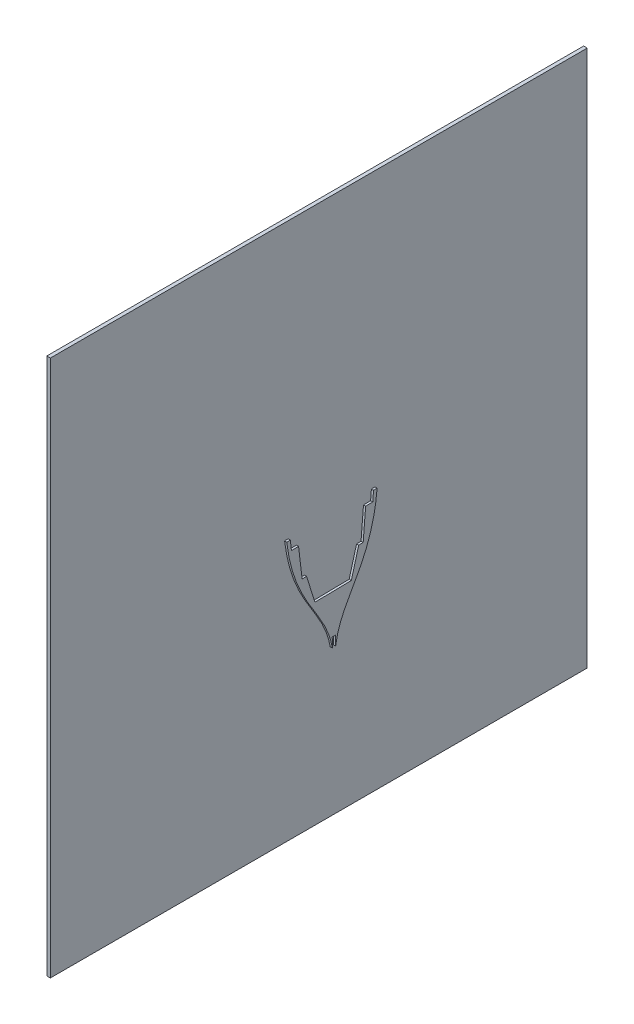
ISO-10303-21;
HEADER;
FILE_DESCRIPTION(('STEP AP214'),'2;1');
FILE_NAME('part.step','',(''),(''),'','','');
FILE_SCHEMA(('AUTOMOTIVE_DESIGN { 1 0 10303 214 1 1 1 1 }'));
ENDSEC;
DATA;
#1=APPLICATION_CONTEXT('core data for automotive mechanical design processes');
#2=APPLICATION_PROTOCOL_DEFINITION('international standard','automotive_design',2000,#1);
#3=PRODUCT_CONTEXT('',#1,'mechanical');
#4=PRODUCT('Part','Part','',(#3));
#5=PRODUCT_RELATED_PRODUCT_CATEGORY('part','',(#4));
#6=PRODUCT_DEFINITION_FORMATION('','',#4);
#7=PRODUCT_DEFINITION_CONTEXT('part definition',#1,'design');
#8=PRODUCT_DEFINITION('design','',#6,#7);
#9=PRODUCT_DEFINITION_SHAPE('','',#8);
#10=(LENGTH_UNIT() NAMED_UNIT(*) SI_UNIT(.MILLI.,.METRE.));
#11=(NAMED_UNIT(*) PLANE_ANGLE_UNIT() SI_UNIT($,.RADIAN.));
#12=(NAMED_UNIT(*) SI_UNIT($,.STERADIAN.) SOLID_ANGLE_UNIT());
#13=UNCERTAINTY_MEASURE_WITH_UNIT(LENGTH_MEASURE(1.E-05),#10,'distance_accuracy_value','');
#14=(GEOMETRIC_REPRESENTATION_CONTEXT(3) GLOBAL_UNCERTAINTY_ASSIGNED_CONTEXT((#13)) GLOBAL_UNIT_ASSIGNED_CONTEXT((#10,
#11,#12)) REPRESENTATION_CONTEXT('',''));
#15=CARTESIAN_POINT('',(0.,0.,0.));
#16=DIRECTION('',(0.,0.,1.));
#17=DIRECTION('',(1.,0.,0.));
#18=AXIS2_PLACEMENT_3D('',#15,#16,#17);
#19=CARTESIAN_POINT('',(6.,361.602212700879,132.834590280757));
#20=CARTESIAN_POINT('',(6.,164.351037202776,108.956470003983));
#21=CARTESIAN_POINT('',(6.,142.634498604343,10.6463537208363));
#22=CARTESIAN_POINT('',(6.,58.2126589897996,5.90653160147248));
#23=CARTESIAN_POINT('',(6.,0.,0.));
#24=B_SPLINE_CURVE_WITH_KNOTS('',4,(#19,#20,#21,#22,#23),.UNSPECIFIED.,.F.,.F.,(5,5),(0.,1.),.UNSPECIFIED.);
#25=DIRECTION('',(-1.,0.,0.));
#26=VECTOR('',#25,1.);
#27=SURFACE_OF_LINEAR_EXTRUSION('',#24,#26);
#28=CARTESIAN_POINT('',(0.,361.602212700879,132.834590280757));
#29=CARTESIAN_POINT('',(0.,164.351037202776,108.956470003983));
#30=CARTESIAN_POINT('',(0.,142.634498604343,10.6463537208363));
#31=CARTESIAN_POINT('',(0.,58.2126589897996,5.90653160147248));
#32=CARTESIAN_POINT('',(0.,0.,0.));
#33=B_SPLINE_CURVE_WITH_KNOTS('',4,(#28,#29,#30,#31,#32),.UNSPECIFIED.,.F.,.F.,(5,5),(0.,1.),.UNSPECIFIED.);
#34=CARTESIAN_POINT('',(0.,361.602212700879,132.834590280757));
#35=VERTEX_POINT('',#34);
#36=CARTESIAN_POINT('',(0.,41.5610946880075,5.2543716604558));
#37=VERTEX_POINT('',#36);
#38=EDGE_CURVE('E192',#35,#37,#33,.T.);
#39=ORIENTED_EDGE('',*,*,#38,.T.);
#40=DIRECTION('',(1.,0.,0.));
#41=VECTOR('',#40,1.);
#42=CARTESIAN_POINT('',(0.,41.5610946880075,5.2543716604558));
#43=LINE('',#42,#41);
#44=CARTESIAN_POINT('',(6.,41.5610946880075,5.2543716604558));
#45=VERTEX_POINT('',#44);
#46=EDGE_CURVE('E198',#37,#45,#43,.T.);
#47=ORIENTED_EDGE('',*,*,#46,.T.);
#48=CARTESIAN_POINT('',(6.,361.602212700879,132.834590280757));
#49=VERTEX_POINT('',#48);
#50=EDGE_CURVE('E232',#49,#45,#24,.T.);
#51=ORIENTED_EDGE('',*,*,#50,.F.);
#52=DIRECTION('',(-1.,0.,0.));
#53=VECTOR('',#52,1.);
#54=CARTESIAN_POINT('',(6.,361.602212700879,132.834590280757));
#55=LINE('',#54,#53);
#56=EDGE_CURVE('E188',#49,#35,#55,.T.);
#57=ORIENTED_EDGE('',*,*,#56,.T.);
#58=EDGE_LOOP('',(#39,#47,#51,#57));
#59=FACE_BOUND('',#58,.T.);
#60=ADVANCED_FACE('F45',(#59),#27,.F.);
#61=CARTESIAN_POINT('',(6.,0.,0.));
#62=CARTESIAN_POINT('',(6.,58.3883924814716,-3.79425956564894));
#63=CARTESIAN_POINT('',(6.,142.926512362681,-5.47330827762449));
#64=CARTESIAN_POINT('',(6.,168.189483530413,-102.932373018065));
#65=CARTESIAN_POINT('',(6.,366.176077391648,-119.650611997159));
#66=B_SPLINE_CURVE_WITH_KNOTS('',4,(#61,#62,#63,#64,#65),.UNSPECIFIED.,.F.,.F.,(5,5),(0.,1.),.UNSPECIFIED.);
#67=DIRECTION('',(-1.,0.,0.));
#68=VECTOR('',#67,1.);
#69=SURFACE_OF_LINEAR_EXTRUSION('',#66,#68);
#70=CARTESIAN_POINT('',(6.,41.7241330833095,-3.7456283395442));
#71=VERTEX_POINT('',#70);
#72=CARTESIAN_POINT('',(6.,366.176077391648,-119.650611997159));
#73=VERTEX_POINT('',#72);
#74=EDGE_CURVE('E128',#71,#73,#66,.T.);
#75=ORIENTED_EDGE('',*,*,#74,.F.);
#76=DIRECTION('',(1.,0.,0.));
#77=VECTOR('',#76,1.);
#78=CARTESIAN_POINT('',(0.,41.7241330833095,-3.7456283395442));
#79=LINE('',#78,#77);
#80=CARTESIAN_POINT('',(0.,41.7241330833095,-3.7456283395442));
#81=VERTEX_POINT('',#80);
#82=EDGE_CURVE('E322',#81,#71,#79,.T.);
#83=ORIENTED_EDGE('',*,*,#82,.F.);
#84=CARTESIAN_POINT('',(0.,0.,0.));
#85=CARTESIAN_POINT('',(0.,58.3883924814716,-3.79425956564894));
#86=CARTESIAN_POINT('',(0.,142.926512362681,-5.47330827762449));
#87=CARTESIAN_POINT('',(0.,168.189483530413,-102.932373018065));
#88=CARTESIAN_POINT('',(0.,366.176077391648,-119.650611997159));
#89=B_SPLINE_CURVE_WITH_KNOTS('',4,(#84,#85,#86,#87,#88),.UNSPECIFIED.,.F.,.F.,(5,5),(0.,1.),.UNSPECIFIED.);
#90=CARTESIAN_POINT('',(0.,366.176077391648,-119.650611997159));
#91=VERTEX_POINT('',#90);
#92=EDGE_CURVE('E197',#81,#91,#89,.T.);
#93=ORIENTED_EDGE('',*,*,#92,.T.);
#94=DIRECTION('',(-1.,0.,0.));
#95=VECTOR('',#94,1.);
#96=CARTESIAN_POINT('',(6.,366.176077391648,-119.650611997159));
#97=LINE('',#96,#95);
#98=EDGE_CURVE('E13',#73,#91,#97,.T.);
#99=ORIENTED_EDGE('',*,*,#98,.F.);
#100=EDGE_LOOP('',(#75,#83,#93,#99));
#101=FACE_BOUND('',#100,.T.);
#102=ADVANCED_FACE('F334',(#101),#69,.F.);
#103=CARTESIAN_POINT('',(6.,366.176077391648,-119.650611997159));
#104=DIRECTION('',(0.,-0.999835956927465,-0.0181124055536444));
#105=DIRECTION('',(0.,0.0181124055536444,-0.999835956927465));
#106=AXIS2_PLACEMENT_3D('',#103,#104,#105);
#107=PLANE('',#106);
#108=DIRECTION('',(0.,-0.0181124055536444,0.999835956927465));
#109=VECTOR('',#108,1.);
#110=CARTESIAN_POINT('',(0.,366.176077391648,-119.650611997159));
#111=LINE('',#110,#109);
#112=CARTESIAN_POINT('',(0.,365.99492361909,-109.650611997159));
#113=VERTEX_POINT('',#112);
#114=EDGE_CURVE('E205',#91,#113,#111,.T.);
#115=ORIENTED_EDGE('',*,*,#114,.T.);
#116=DIRECTION('',(-1.,0.,0.));
#117=VECTOR('',#116,1.);
#118=CARTESIAN_POINT('',(6.,365.99492361909,-109.650611997159));
#119=LINE('',#118,#117);
#120=CARTESIAN_POINT('',(6.,365.99492361909,-109.650611997159));
#121=VERTEX_POINT('',#120);
#122=EDGE_CURVE('E53',#121,#113,#119,.T.);
#123=ORIENTED_EDGE('',*,*,#122,.F.);
#124=DIRECTION('',(0.,-0.0181124055536444,0.999835956927465));
#125=VECTOR('',#124,1.);
#126=CARTESIAN_POINT('',(6.,366.176077391648,-119.650611997159));
#127=LINE('',#126,#125);
#128=EDGE_CURVE('E316',#73,#121,#127,.T.);
#129=ORIENTED_EDGE('',*,*,#128,.F.);
#130=ORIENTED_EDGE('',*,*,#98,.T.);
#131=EDGE_LOOP('',(#115,#123,#129,#130));
#132=FACE_BOUND('',#131,.T.);
#133=ADVANCED_FACE('F337',(#132),#107,.F.);
#134=CARTESIAN_POINT('',(6.,365.99492361909,-109.650611997159));
#135=DIRECTION('',(0.,-0.0782638409439782,-0.996932681378585));
#136=DIRECTION('',(0.,0.996932681378585,-0.0782638409439782));
#137=AXIS2_PLACEMENT_3D('',#134,#135,#136);
#138=PLANE('',#137);
#139=DIRECTION('',(0.,-0.996932681378585,0.0782638409439782));
#140=VECTOR('',#139,1.);
#141=CARTESIAN_POINT('',(0.,365.99492361909,-109.650611997159));
#142=LINE('',#141,#140);
#143=CARTESIAN_POINT('',(0.,338.792154680511,-107.515068423143));
#144=VERTEX_POINT('',#143);
#145=EDGE_CURVE('E210',#113,#144,#142,.T.);
#146=ORIENTED_EDGE('',*,*,#145,.T.);
#147=DIRECTION('',(-1.,0.,0.));
#148=VECTOR('',#147,1.);
#149=CARTESIAN_POINT('',(6.,338.792154680511,-107.515068423143));
#150=LINE('',#149,#148);
#151=CARTESIAN_POINT('',(6.,338.792154680511,-107.515068423143));
#152=VERTEX_POINT('',#151);
#153=EDGE_CURVE('E257',#152,#144,#150,.T.);
#154=ORIENTED_EDGE('',*,*,#153,.F.);
#155=DIRECTION('',(0.,-0.996932681378585,0.0782638409439782));
#156=VECTOR('',#155,1.);
#157=CARTESIAN_POINT('',(6.,365.99492361909,-109.650611997159));
#158=LINE('',#157,#156);
#159=EDGE_CURVE('E266',#121,#152,#158,.T.);
#160=ORIENTED_EDGE('',*,*,#159,.F.);
#161=ORIENTED_EDGE('',*,*,#122,.T.);
#162=EDGE_LOOP('',(#146,#154,#160,#161));
#163=FACE_BOUND('',#162,.T.);
#164=ADVANCED_FACE('F264',(#163),#138,.F.);
#165=CARTESIAN_POINT('',(6.,338.792154680511,-107.515068423143));
#166=DIRECTION('',(0.,-0.999835956927465,-0.0181124055536416));
#167=DIRECTION('',(0.,0.0181124055536416,-0.999835956927466));
#168=AXIS2_PLACEMENT_3D('',#165,#166,#167);
#169=PLANE('',#168);
#170=DIRECTION('',(0.,-0.0181124055536416,0.999835956927465));
#171=VECTOR('',#170,1.);
#172=CARTESIAN_POINT('',(0.,338.792154680511,-107.515068423143));
#173=LINE('',#172,#171);
#174=CARTESIAN_POINT('',(0.,338.431086885036,-87.5835047368577));
#175=VERTEX_POINT('',#174);
#176=EDGE_CURVE('E212',#144,#175,#173,.T.);
#177=ORIENTED_EDGE('',*,*,#176,.T.);
#178=DIRECTION('',(-1.,0.,0.));
#179=VECTOR('',#178,1.);
#180=CARTESIAN_POINT('',(6.,338.431086885036,-87.5835047368577));
#181=LINE('',#180,#179);
#182=CARTESIAN_POINT('',(6.,338.431086885036,-87.5835047368577));
#183=VERTEX_POINT('',#182);
#184=EDGE_CURVE('E254',#183,#175,#181,.T.);
#185=ORIENTED_EDGE('',*,*,#184,.F.);
#186=DIRECTION('',(0.,-0.0181124055536416,0.999835956927465));
#187=VECTOR('',#186,1.);
#188=CARTESIAN_POINT('',(6.,338.792154680511,-107.515068423143));
#189=LINE('',#188,#187);
#190=EDGE_CURVE('E287',#152,#183,#189,.T.);
#191=ORIENTED_EDGE('',*,*,#190,.F.);
#192=ORIENTED_EDGE('',*,*,#153,.T.);
#193=EDGE_LOOP('',(#177,#185,#191,#192));
#194=FACE_BOUND('',#193,.T.);
#195=ADVANCED_FACE('F278',(#194),#169,.F.);
#196=CARTESIAN_POINT('',(6.,338.431086885036,-87.5835047368577));
#197=DIRECTION('',(0.,-0.0808804811789135,-0.996723807162379));
#198=DIRECTION('',(0.,0.996723807162379,-0.0808804811789135));
#199=AXIS2_PLACEMENT_3D('',#196,#197,#198);
#200=PLANE('',#199);
#201=DIRECTION('',(0.,-0.996723807162379,0.0808804811789134));
#202=VECTOR('',#201,1.);
#203=CARTESIAN_POINT('',(0.,338.431086885036,-87.5835047368577));
#204=LINE('',#203,#202);
#205=CARTESIAN_POINT('',(0.,254.083869200384,-80.7390373895198));
#206=VERTEX_POINT('',#205);
#207=EDGE_CURVE('E214',#175,#206,#204,.T.);
#208=ORIENTED_EDGE('',*,*,#207,.T.);
#209=DIRECTION('',(-1.,0.,0.));
#210=VECTOR('',#209,1.);
#211=CARTESIAN_POINT('',(6.,254.083869200384,-80.7390373895198));
#212=LINE('',#211,#210);
#213=CARTESIAN_POINT('',(6.,254.083869200384,-80.7390373895198));
#214=VERTEX_POINT('',#213);
#215=EDGE_CURVE('E251',#214,#206,#212,.T.);
#216=ORIENTED_EDGE('',*,*,#215,.F.);
#217=DIRECTION('',(0.,-0.996723807162379,0.0808804811789134));
#218=VECTOR('',#217,1.);
#219=CARTESIAN_POINT('',(6.,338.431086885036,-87.5835047368577));
#220=LINE('',#219,#218);
#221=EDGE_CURVE('E284',#183,#214,#220,.T.);
#222=ORIENTED_EDGE('',*,*,#221,.F.);
#223=ORIENTED_EDGE('',*,*,#184,.T.);
#224=EDGE_LOOP('',(#208,#216,#222,#223));
#225=FACE_BOUND('',#224,.T.);
#226=ADVANCED_FACE('F282',(#225),#200,.F.);
#227=CARTESIAN_POINT('',(6.,254.083869200384,-80.7390373895198));
#228=DIRECTION('',(0.,-0.999835956927465,-0.0181124055536436));
#229=DIRECTION('',(0.,0.0181124055536437,-0.999835956927466));
#230=AXIS2_PLACEMENT_3D('',#227,#228,#229);
#231=PLANE('',#230);
#232=DIRECTION('',(0.,-0.0181124055536436,0.999835956927465));
#233=VECTOR('',#232,1.);
#234=CARTESIAN_POINT('',(0.,254.083869200384,-80.7390373895198));
#235=LINE('',#234,#233);
#236=CARTESIAN_POINT('',(0.,253.857964721847,-68.2687214061583));
#237=VERTEX_POINT('',#236);
#238=EDGE_CURVE('E216',#206,#237,#235,.T.);
#239=ORIENTED_EDGE('',*,*,#238,.T.);
#240=DIRECTION('',(-1.,0.,0.));
#241=VECTOR('',#240,1.);
#242=CARTESIAN_POINT('',(6.,253.857964721847,-68.2687214061583));
#243=LINE('',#242,#241);
#244=CARTESIAN_POINT('',(6.,253.857964721847,-68.2687214061583));
#245=VERTEX_POINT('',#244);
#246=EDGE_CURVE('E248',#245,#237,#243,.T.);
#247=ORIENTED_EDGE('',*,*,#246,.F.);
#248=DIRECTION('',(0.,-0.0181124055536436,0.999835956927465));
#249=VECTOR('',#248,1.);
#250=CARTESIAN_POINT('',(6.,254.083869200384,-80.7390373895198));
#251=LINE('',#250,#249);
#252=EDGE_CURVE('E286',#214,#245,#251,.T.);
#253=ORIENTED_EDGE('',*,*,#252,.F.);
#254=ORIENTED_EDGE('',*,*,#215,.T.);
#255=EDGE_LOOP('',(#239,#247,#253,#254));
#256=FACE_BOUND('',#255,.T.);
#257=ADVANCED_FACE('F347',(#256),#231,.F.);
#258=CARTESIAN_POINT('',(6.,253.857964721847,-68.2687214061583));
#259=DIRECTION('',(0.,-0.264570789949569,-0.96436626709226));
#260=DIRECTION('',(0.,0.96436626709226,-0.264570789949569));
#261=AXIS2_PLACEMENT_3D('',#258,#259,#260);
#262=PLANE('',#261);
#263=DIRECTION('',(0.,-0.96436626709226,0.264570789949569));
#264=VECTOR('',#263,1.);
#265=CARTESIAN_POINT('',(0.,253.857964721847,-68.2687214061583));
#266=LINE('',#265,#264);
#267=CARTESIAN_POINT('',(0.,178.721523841287,-47.6552800238635));
#268=VERTEX_POINT('',#267);
#269=EDGE_CURVE('E218',#237,#268,#266,.T.);
#270=ORIENTED_EDGE('',*,*,#269,.T.);
#271=DIRECTION('',(-1.,0.,0.));
#272=VECTOR('',#271,1.);
#273=CARTESIAN_POINT('',(6.,178.721523841287,-47.6552800238635));
#274=LINE('',#273,#272);
#275=CARTESIAN_POINT('',(6.,178.721523841287,-47.6552800238635));
#276=VERTEX_POINT('',#275);
#277=EDGE_CURVE('E245',#276,#268,#274,.T.);
#278=ORIENTED_EDGE('',*,*,#277,.F.);
#279=DIRECTION('',(0.,-0.96436626709226,0.264570789949569));
#280=VECTOR('',#279,1.);
#281=CARTESIAN_POINT('',(6.,253.857964721847,-68.2687214061583));
#282=LINE('',#281,#280);
#283=EDGE_CURVE('E289',#245,#276,#282,.T.);
#284=ORIENTED_EDGE('',*,*,#283,.F.);
#285=ORIENTED_EDGE('',*,*,#246,.T.);
#286=EDGE_LOOP('',(#270,#278,#284,#285));
#287=FACE_BOUND('',#286,.T.);
#288=ADVANCED_FACE('F350',(#287),#262,.F.);
#289=CARTESIAN_POINT('',(6.,178.721523841287,-47.6552800238635));
#290=DIRECTION('',(0.,-0.999835956927465,-0.0181124055536431));
#291=DIRECTION('',(0.,0.0181124055536431,-0.999835956927466));
#292=AXIS2_PLACEMENT_3D('',#289,#290,#291);
#293=PLANE('',#292);
#294=DIRECTION('',(0.,-0.0181124055536431,0.999835956927465));
#295=VECTOR('',#294,1.);
#296=CARTESIAN_POINT('',(0.,178.721523841287,-47.6552800238635));
#297=LINE('',#296,#295);
#298=CARTESIAN_POINT('',(0.,176.878241019534,54.0971039163866));
#299=VERTEX_POINT('',#298);
#300=EDGE_CURVE('E220',#268,#299,#297,.T.);
#301=ORIENTED_EDGE('',*,*,#300,.T.);
#302=DIRECTION('',(-1.,0.,0.));
#303=VECTOR('',#302,1.);
#304=CARTESIAN_POINT('',(6.,176.878241019534,54.0971039163866));
#305=LINE('',#304,#303);
#306=CARTESIAN_POINT('',(6.,176.878241019534,54.0971039163866));
#307=VERTEX_POINT('',#306);
#308=EDGE_CURVE('E242',#307,#299,#305,.T.);
#309=ORIENTED_EDGE('',*,*,#308,.F.);
#310=DIRECTION('',(0.,-0.0181124055536431,0.999835956927465));
#311=VECTOR('',#310,1.);
#312=CARTESIAN_POINT('',(6.,178.721523841287,-47.6552800238635));
#313=LINE('',#312,#311);
#314=EDGE_CURVE('E295',#276,#307,#313,.T.);
#315=ORIENTED_EDGE('',*,*,#314,.F.);
#316=ORIENTED_EDGE('',*,*,#277,.T.);
#317=EDGE_LOOP('',(#301,#309,#315,#316));
#318=FACE_BOUND('',#317,.T.);
#319=ADVANCED_FACE('F354',(#318),#293,.F.);
#320=CARTESIAN_POINT('',(6.,251.218787967044,77.4183773242459));
#321=DIRECTION('',(0.,-0.299325455352973,0.954151073875482));
#322=DIRECTION('',(0.,-0.954151073875482,-0.299325455352973));
#323=AXIS2_PLACEMENT_3D('',#320,#321,#322);
#324=PLANE('',#323);
#325=DIRECTION('',(0.,0.954151073875482,0.299325455352973));
#326=VECTOR('',#325,1.);
#327=CARTESIAN_POINT('',(0.,251.218787967044,77.4183773242459));
#328=LINE('',#327,#326);
#329=CARTESIAN_POINT('',(0.,251.218787967044,77.4183773242459));
#330=VERTEX_POINT('',#329);
#331=EDGE_CURVE('E222',#299,#330,#328,.T.);
#332=ORIENTED_EDGE('',*,*,#331,.T.);
#333=DIRECTION('',(-1.,0.,0.));
#334=VECTOR('',#333,1.);
#335=CARTESIAN_POINT('',(6.,251.218787967044,77.4183773242459));
#336=LINE('',#335,#334);
#337=CARTESIAN_POINT('',(6.,251.218787967044,77.4183773242459));
#338=VERTEX_POINT('',#337);
#339=EDGE_CURVE('E239',#338,#330,#336,.T.);
#340=ORIENTED_EDGE('',*,*,#339,.F.);
#341=DIRECTION('',(0.,0.954151073875482,0.299325455352973));
#342=VECTOR('',#341,1.);
#343=CARTESIAN_POINT('',(6.,251.218787967044,77.4183773242459));
#344=LINE('',#343,#342);
#345=EDGE_CURVE('E297',#307,#338,#344,.T.);
#346=ORIENTED_EDGE('',*,*,#345,.F.);
#347=ORIENTED_EDGE('',*,*,#308,.T.);
#348=EDGE_LOOP('',(#332,#340,#346,#347));
#349=FACE_BOUND('',#348,.T.);
#350=ADVANCED_FACE('F358',(#349),#324,.F.);
#351=CARTESIAN_POINT('',(6.,250.992883488507,89.8886933076074));
#352=DIRECTION('',(0.,-0.999835956927465,-0.0181124055536436));
#353=DIRECTION('',(0.,0.0181124055536437,-0.999835956927466));
#354=AXIS2_PLACEMENT_3D('',#351,#352,#353);
#355=PLANE('',#354);
#356=DIRECTION('',(0.,-0.0181124055536436,0.999835956927465));
#357=VECTOR('',#356,1.);
#358=CARTESIAN_POINT('',(0.,250.992883488507,89.8886933076074));
#359=LINE('',#358,#357);
#360=CARTESIAN_POINT('',(0.,250.992883488507,89.8886933076074));
#361=VERTEX_POINT('',#360);
#362=EDGE_CURVE('E224',#330,#361,#359,.T.);
#363=ORIENTED_EDGE('',*,*,#362,.T.);
#364=DIRECTION('',(-1.,0.,0.));
#365=VECTOR('',#364,1.);
#366=CARTESIAN_POINT('',(6.,250.992883488507,89.8886933076074));
#367=LINE('',#366,#365);
#368=CARTESIAN_POINT('',(6.,250.992883488507,89.8886933076074));
#369=VERTEX_POINT('',#368);
#370=EDGE_CURVE('E236',#369,#361,#367,.T.);
#371=ORIENTED_EDGE('',*,*,#370,.F.);
#372=DIRECTION('',(0.,-0.0181124055536436,0.999835956927465));
#373=VECTOR('',#372,1.);
#374=CARTESIAN_POINT('',(6.,250.992883488507,89.8886933076074));
#375=LINE('',#374,#373);
#376=EDGE_CURVE('E299',#338,#369,#375,.T.);
#377=ORIENTED_EDGE('',*,*,#376,.F.);
#378=ORIENTED_EDGE('',*,*,#339,.T.);
#379=EDGE_LOOP('',(#363,#371,#377,#378));
#380=FACE_BOUND('',#379,.T.);
#381=ADVANCED_FACE('F305',(#380),#355,.F.);
#382=CARTESIAN_POINT('',(6.,335.036860541729,99.7836306741747));
#383=DIRECTION('',(0.,-0.116927622681179,0.993140438736701));
#384=DIRECTION('',(0.,-0.993140438736701,-0.116927622681179));
#385=AXIS2_PLACEMENT_3D('',#382,#383,#384);
#386=PLANE('',#385);
#387=DIRECTION('',(0.,0.993140438736701,0.116927622681179));
#388=VECTOR('',#387,1.);
#389=CARTESIAN_POINT('',(0.,335.036860541729,99.7836306741747));
#390=LINE('',#389,#388);
#391=CARTESIAN_POINT('',(0.,335.036860541729,99.7836306741747));
#392=VERTEX_POINT('',#391);
#393=EDGE_CURVE('E226',#361,#392,#390,.T.);
#394=ORIENTED_EDGE('',*,*,#393,.T.);
#395=DIRECTION('',(-1.,0.,0.));
#396=VECTOR('',#395,1.);
#397=CARTESIAN_POINT('',(6.,335.036860541729,99.7836306741747));
#398=LINE('',#397,#396);
#399=CARTESIAN_POINT('',(6.,335.036860541729,99.7836306741747));
#400=VERTEX_POINT('',#399);
#401=EDGE_CURVE('E183',#400,#392,#398,.T.);
#402=ORIENTED_EDGE('',*,*,#401,.F.);
#403=DIRECTION('',(0.,0.993140438736701,0.116927622681179));
#404=VECTOR('',#403,1.);
#405=CARTESIAN_POINT('',(6.,335.036860541729,99.7836306741747));
#406=LINE('',#405,#404);
#407=EDGE_CURVE('E171',#369,#400,#406,.T.);
#408=ORIENTED_EDGE('',*,*,#407,.F.);
#409=ORIENTED_EDGE('',*,*,#370,.T.);
#410=EDGE_LOOP('',(#394,#402,#408,#409));
#411=FACE_BOUND('',#410,.T.);
#412=ADVANCED_FACE('F309',(#411),#386,.F.);
#413=CARTESIAN_POINT('',(6.,334.675792746254,119.71519436046));
#414=DIRECTION('',(0.,-0.999835956927465,-0.0181124055536416));
#415=DIRECTION('',(0.,0.0181124055536416,-0.999835956927466));
#416=AXIS2_PLACEMENT_3D('',#413,#414,#415);
#417=PLANE('',#416);
#418=DIRECTION('',(0.,-0.0181124055536416,0.999835956927465));
#419=VECTOR('',#418,1.);
#420=CARTESIAN_POINT('',(0.,334.675792746254,119.71519436046));
#421=LINE('',#420,#419);
#422=CARTESIAN_POINT('',(0.,334.675792746254,119.71519436046));
#423=VERTEX_POINT('',#422);
#424=EDGE_CURVE('E180',#392,#423,#421,.T.);
#425=ORIENTED_EDGE('',*,*,#424,.T.);
#426=DIRECTION('',(-1.,0.,0.));
#427=VECTOR('',#426,1.);
#428=CARTESIAN_POINT('',(6.,334.675792746254,119.71519436046));
#429=LINE('',#428,#427);
#430=CARTESIAN_POINT('',(6.,334.675792746254,119.71519436046));
#431=VERTEX_POINT('',#430);
#432=EDGE_CURVE('E177',#431,#423,#429,.T.);
#433=ORIENTED_EDGE('',*,*,#432,.F.);
#434=DIRECTION('',(0.,-0.0181124055536416,0.999835956927465));
#435=VECTOR('',#434,1.);
#436=CARTESIAN_POINT('',(6.,334.675792746254,119.71519436046));
#437=LINE('',#436,#435);
#438=EDGE_CURVE('E163',#400,#431,#437,.T.);
#439=ORIENTED_EDGE('',*,*,#438,.F.);
#440=ORIENTED_EDGE('',*,*,#401,.T.);
#441=EDGE_LOOP('',(#425,#433,#439,#440));
#442=FACE_BOUND('',#441,.T.);
#443=ADVANCED_FACE('F178',(#442),#417,.F.);
#444=CARTESIAN_POINT('',(6.,361.783366473437,122.834590280757));
#445=DIRECTION('',(0.,-0.114320264460041,0.993443947655723));
#446=DIRECTION('',(0.,-0.993443947655723,-0.114320264460041));
#447=AXIS2_PLACEMENT_3D('',#444,#445,#446);
#448=PLANE('',#447);
#449=DIRECTION('',(0.,0.993443947655723,0.114320264460041));
#450=VECTOR('',#449,1.);
#451=CARTESIAN_POINT('',(0.,361.783366473437,122.834590280757));
#452=LINE('',#451,#450);
#453=CARTESIAN_POINT('',(0.,361.783366473437,122.834590280757));
#454=VERTEX_POINT('',#453);
#455=EDGE_CURVE('E229',#423,#454,#452,.T.);
#456=ORIENTED_EDGE('',*,*,#455,.T.);
#457=DIRECTION('',(-1.,0.,0.));
#458=VECTOR('',#457,1.);
#459=CARTESIAN_POINT('',(6.,361.783366473437,122.834590280757));
#460=LINE('',#459,#458);
#461=CARTESIAN_POINT('',(6.,361.783366473437,122.834590280757));
#462=VERTEX_POINT('',#461);
#463=EDGE_CURVE('E184',#462,#454,#460,.T.);
#464=ORIENTED_EDGE('',*,*,#463,.F.);
#465=DIRECTION('',(0.,0.993443947655723,0.114320264460041));
#466=VECTOR('',#465,1.);
#467=CARTESIAN_POINT('',(6.,361.783366473437,122.834590280757));
#468=LINE('',#467,#466);
#469=EDGE_CURVE('E168',#431,#462,#468,.T.);
#470=ORIENTED_EDGE('',*,*,#469,.F.);
#471=ORIENTED_EDGE('',*,*,#432,.T.);
#472=EDGE_LOOP('',(#456,#464,#470,#471));
#473=FACE_BOUND('',#472,.T.);
#474=ADVANCED_FACE('F186',(#473),#448,.F.);
#475=CARTESIAN_POINT('',(6.,361.602212700879,132.834590280757));
#476=DIRECTION('',(0.,-0.999835956927465,-0.0181124055536391));
#477=DIRECTION('',(0.,0.0181124055536391,-0.999835956927465));
#478=AXIS2_PLACEMENT_3D('',#475,#476,#477);
#479=PLANE('',#478);
#480=DIRECTION('',(0.,-0.0181124055536391,0.999835956927465));
#481=VECTOR('',#480,1.);
#482=CARTESIAN_POINT('',(0.,361.602212700879,132.834590280757));
#483=LINE('',#482,#481);
#484=EDGE_CURVE('E120',#454,#35,#483,.T.);
#485=ORIENTED_EDGE('',*,*,#484,.T.);
#486=ORIENTED_EDGE('',*,*,#56,.F.);
#487=DIRECTION('',(0.,-0.0181124055536391,0.999835956927465));
#488=VECTOR('',#487,1.);
#489=CARTESIAN_POINT('',(6.,361.602212700879,132.834590280757));
#490=LINE('',#489,#488);
#491=EDGE_CURVE('E69',#462,#49,#490,.T.);
#492=ORIENTED_EDGE('',*,*,#491,.F.);
#493=ORIENTED_EDGE('',*,*,#463,.T.);
#494=EDGE_LOOP('',(#485,#486,#492,#493));
#495=FACE_BOUND('',#494,.T.);
#496=ADVANCED_FACE('F311',(#495),#479,.F.);
#497=CARTESIAN_POINT('',(6.,131.728999318578,41.0102949392248));
#498=DIRECTION('',(1.,0.,0.));
#499=DIRECTION('',(0.,0.,-1.));
#500=AXIS2_PLACEMENT_3D('',#497,#498,#499);
#501=PLANE('',#500);
#502=DIRECTION('',(0.,-0.999835956927465,-0.018112405553643));
#503=VECTOR('',#502,1.);
#504=CARTESIAN_POINT('',(6.,41.5610946880075,5.2543716604558));
#505=LINE('',#504,#503);
#506=CARTESIAN_POINT('',(6.,68.5610946880074,5.74348684636208));
#507=VERTEX_POINT('',#506);
#508=EDGE_CURVE('E510',#507,#45,#505,.T.);
#509=ORIENTED_EDGE('',*,*,#508,.F.);
#510=DIRECTION('',(0.,-0.0181124055536438,0.999835956927465));
#511=VECTOR('',#510,1.);
#512=CARTESIAN_POINT('',(6.,68.5610946880074,5.74348684636208));
#513=LINE('',#512,#511);
#514=CARTESIAN_POINT('',(6.,68.7241330833096,-3.25651315363792));
#515=VERTEX_POINT('',#514);
#516=EDGE_CURVE('E519',#515,#507,#513,.T.);
#517=ORIENTED_EDGE('',*,*,#516,.F.);
#518=DIRECTION('',(0.,0.999835956927465,0.0181124055536428));
#519=VECTOR('',#518,1.);
#520=CARTESIAN_POINT('',(6.,68.7241330833096,-3.25651315363792));
#521=LINE('',#520,#519);
#522=EDGE_CURVE('E523',#71,#515,#521,.T.);
#523=ORIENTED_EDGE('',*,*,#522,.F.);
#524=ORIENTED_EDGE('',*,*,#74,.T.);
#525=ORIENTED_EDGE('',*,*,#128,.T.);
#526=ORIENTED_EDGE('',*,*,#159,.T.);
#527=ORIENTED_EDGE('',*,*,#190,.T.);
#528=ORIENTED_EDGE('',*,*,#221,.T.);
#529=ORIENTED_EDGE('',*,*,#252,.T.);
#530=ORIENTED_EDGE('',*,*,#283,.T.);
#531=ORIENTED_EDGE('',*,*,#314,.T.);
#532=ORIENTED_EDGE('',*,*,#345,.T.);
#533=ORIENTED_EDGE('',*,*,#376,.T.);
#534=ORIENTED_EDGE('',*,*,#407,.T.);
#535=ORIENTED_EDGE('',*,*,#438,.T.);
#536=ORIENTED_EDGE('',*,*,#469,.T.);
#537=ORIENTED_EDGE('',*,*,#491,.T.);
#538=ORIENTED_EDGE('',*,*,#50,.T.);
#539=EDGE_LOOP('',(#509,#517,#523,#524,#525,#526,#527,#528,#529,#530,#531,#532,#533,#534,#535,
#536,#537,#538));
#540=FACE_BOUND('',#539,.T.);
#541=ADVANCED_FACE('F166',(#540),#501,.T.);
#542=CARTESIAN_POINT('',(0.,131.728999318578,41.0102949392248));
#543=DIRECTION('',(1.,0.,0.));
#544=DIRECTION('',(0.,0.,-1.));
#545=AXIS2_PLACEMENT_3D('',#542,#543,#544);
#546=PLANE('',#545);
#547=DIRECTION('',(0.,-0.0181124055536438,0.999835956927465));
#548=VECTOR('',#547,1.);
#549=CARTESIAN_POINT('',(0.,68.5610946880074,5.74348684636208));
#550=LINE('',#549,#548);
#551=CARTESIAN_POINT('',(0.,68.7241330833096,-3.25651315363792));
#552=VERTEX_POINT('',#551);
#553=CARTESIAN_POINT('',(0.,68.5610946880074,5.74348684636208));
#554=VERTEX_POINT('',#553);
#555=EDGE_CURVE('E60',#552,#554,#550,.T.);
#556=ORIENTED_EDGE('',*,*,#555,.T.);
#557=DIRECTION('',(0.,-0.999835956927465,-0.018112405553643));
#558=VECTOR('',#557,1.);
#559=CARTESIAN_POINT('',(0.,41.5610946880075,5.2543716604558));
#560=LINE('',#559,#558);
#561=EDGE_CURVE('E532',#554,#37,#560,.T.);
#562=ORIENTED_EDGE('',*,*,#561,.T.);
#563=ORIENTED_EDGE('',*,*,#38,.F.);
#564=ORIENTED_EDGE('',*,*,#484,.F.);
#565=ORIENTED_EDGE('',*,*,#455,.F.);
#566=ORIENTED_EDGE('',*,*,#424,.F.);
#567=ORIENTED_EDGE('',*,*,#393,.F.);
#568=ORIENTED_EDGE('',*,*,#362,.F.);
#569=ORIENTED_EDGE('',*,*,#331,.F.);
#570=ORIENTED_EDGE('',*,*,#300,.F.);
#571=ORIENTED_EDGE('',*,*,#269,.F.);
#572=ORIENTED_EDGE('',*,*,#238,.F.);
#573=ORIENTED_EDGE('',*,*,#207,.F.);
#574=ORIENTED_EDGE('',*,*,#176,.F.);
#575=ORIENTED_EDGE('',*,*,#145,.F.);
#576=ORIENTED_EDGE('',*,*,#114,.F.);
#577=ORIENTED_EDGE('',*,*,#92,.F.);
#578=DIRECTION('',(0.,0.999835956927465,0.0181124055536428));
#579=VECTOR('',#578,1.);
#580=CARTESIAN_POINT('',(0.,68.7241330833096,-3.25651315363792));
#581=LINE('',#580,#579);
#582=EDGE_CURVE('E518',#81,#552,#581,.T.);
#583=ORIENTED_EDGE('',*,*,#582,.T.);
#584=EDGE_LOOP('',(#556,#562,#563,#564,#565,#566,#567,#568,#569,#570,#571,#572,#573,#574,#575,
#576,#577,#583));
#585=FACE_BOUND('',#584,.T.);
#586=ADVANCED_FACE('F272',(#585),#546,.F.);
#587=CARTESIAN_POINT('',(0.,41.5610946880075,5.2543716604558));
#588=DIRECTION('',(0.,-0.018112405553643,0.999835956927465));
#589=DIRECTION('',(0.,-0.999835956927466,-0.018112405553643));
#590=AXIS2_PLACEMENT_3D('',#587,#588,#589);
#591=PLANE('',#590);
#592=ORIENTED_EDGE('',*,*,#508,.T.);
#593=ORIENTED_EDGE('',*,*,#46,.F.);
#594=ORIENTED_EDGE('',*,*,#561,.F.);
#595=DIRECTION('',(1.,0.,0.));
#596=VECTOR('',#595,1.);
#597=CARTESIAN_POINT('',(0.,68.5610946880074,5.74348684636208));
#598=LINE('',#597,#596);
#599=EDGE_CURVE('E514',#554,#507,#598,.T.);
#600=ORIENTED_EDGE('',*,*,#599,.T.);
#601=EDGE_LOOP('',(#592,#593,#594,#600));
#602=FACE_BOUND('',#601,.T.);
#603=ADVANCED_FACE('F375',(#602),#591,.F.);
#604=CARTESIAN_POINT('',(0.,68.5610946880074,5.74348684636208));
#605=DIRECTION('',(0.,0.999835956927465,0.0181124055536438));
#606=DIRECTION('',(0.,-0.0181124055536438,0.999835956927466));
#607=AXIS2_PLACEMENT_3D('',#604,#605,#606);
#608=PLANE('',#607);
#609=ORIENTED_EDGE('',*,*,#516,.T.);
#610=ORIENTED_EDGE('',*,*,#599,.F.);
#611=ORIENTED_EDGE('',*,*,#555,.F.);
#612=DIRECTION('',(1.,0.,0.));
#613=VECTOR('',#612,1.);
#614=CARTESIAN_POINT('',(0.,68.7241330833096,-3.25651315363792));
#615=LINE('',#614,#613);
#616=EDGE_CURVE('E528',#552,#515,#615,.T.);
#617=ORIENTED_EDGE('',*,*,#616,.T.);
#618=EDGE_LOOP('',(#609,#610,#611,#617));
#619=FACE_BOUND('',#618,.T.);
#620=ADVANCED_FACE('F381',(#619),#608,.F.);
#621=CARTESIAN_POINT('',(0.,68.7241330833096,-3.25651315363792));
#622=DIRECTION('',(0.,0.0181124055536428,-0.999835956927465));
#623=DIRECTION('',(0.,0.999835956927466,0.0181124055536428));
#624=AXIS2_PLACEMENT_3D('',#621,#622,#623);
#625=PLANE('',#624);
#626=ORIENTED_EDGE('',*,*,#522,.T.);
#627=ORIENTED_EDGE('',*,*,#616,.F.);
#628=ORIENTED_EDGE('',*,*,#582,.F.);
#629=ORIENTED_EDGE('',*,*,#82,.T.);
#630=EDGE_LOOP('',(#626,#627,#628,#629));
#631=FACE_BOUND('',#630,.T.);
#632=ADVANCED_FACE('F378',(#631),#625,.F.);
#633=CLOSED_SHELL('',(#60,#102,#133,#164,#195,#226,#257,#288,#319,#350,#381,#412,#443,#474,#496,
#541,#586,#603,#620,#632));
#634=MANIFOLD_SOLID_BREP('B2',#633);
#635=CARTESIAN_POINT('',(-10.,0.,0.));
#636=DIRECTION('',(-1.,0.,0.));
#637=DIRECTION('',(0.,0.,1.));
#638=AXIS2_PLACEMENT_3D('',#635,#636,#637);
#639=PLANE('',#638);
#640=DIRECTION('',(0.,0.,-1.));
#641=VECTOR('',#640,1.);
#642=CARTESIAN_POINT('',(-10.,-378.710653275796,777.274991403029));
#643=LINE('',#642,#641);
#644=CARTESIAN_POINT('',(-10.,-378.710653275796,777.274991403029));
#645=VERTEX_POINT('',#644);
#646=CARTESIAN_POINT('',(-10.,-378.710653275796,-722.725008596971));
#647=VERTEX_POINT('',#646);
#648=EDGE_CURVE('E563',#645,#647,#643,.T.);
#649=ORIENTED_EDGE('',*,*,#648,.T.);
#650=DIRECTION('',(0.,-1.,0.));
#651=VECTOR('',#650,1.);
#652=CARTESIAN_POINT('',(-10.,1121.2893467242,-722.725008596971));
#653=LINE('',#652,#651);
#654=CARTESIAN_POINT('',(-10.,1121.2893467242,-722.725008596971));
#655=VERTEX_POINT('',#654);
#656=EDGE_CURVE('E597',#655,#647,#653,.T.);
#657=ORIENTED_EDGE('',*,*,#656,.F.);
#658=DIRECTION('',(0.,0.,-1.));
#659=VECTOR('',#658,1.);
#660=CARTESIAN_POINT('',(-10.,1121.2893467242,777.274991403029));
#661=LINE('',#660,#659);
#662=CARTESIAN_POINT('',(-10.,1121.2893467242,777.274991403029));
#663=VERTEX_POINT('',#662);
#664=EDGE_CURVE('E594',#663,#655,#661,.T.);
#665=ORIENTED_EDGE('',*,*,#664,.F.);
#666=DIRECTION('',(0.,-1.,0.));
#667=VECTOR('',#666,1.);
#668=CARTESIAN_POINT('',(-10.,1121.2893467242,777.274991403029));
#669=LINE('',#668,#667);
#670=EDGE_CURVE('E591',#663,#645,#669,.T.);
#671=ORIENTED_EDGE('',*,*,#670,.T.);
#672=EDGE_LOOP('',(#649,#657,#665,#671));
#673=FACE_BOUND('',#672,.T.);
#674=ADVANCED_FACE('F554',(#673),#639,.F.);
#675=CARTESIAN_POINT('',(-20.,0.,0.));
#676=DIRECTION('',(-1.,0.,0.));
#677=DIRECTION('',(0.,0.,1.));
#678=AXIS2_PLACEMENT_3D('',#675,#676,#677);
#679=PLANE('',#678);
#680=DIRECTION('',(0.,0.,-1.));
#681=VECTOR('',#680,1.);
#682=CARTESIAN_POINT('',(-20.,-378.710653275796,777.274991403029));
#683=LINE('',#682,#681);
#684=CARTESIAN_POINT('',(-20.,-378.710653275796,777.274991403029));
#685=VERTEX_POINT('',#684);
#686=CARTESIAN_POINT('',(-20.,-378.710653275796,-722.725008596971));
#687=VERTEX_POINT('',#686);
#688=EDGE_CURVE('E43',#685,#687,#683,.T.);
#689=ORIENTED_EDGE('',*,*,#688,.F.);
#690=DIRECTION('',(0.,-1.,0.));
#691=VECTOR('',#690,1.);
#692=CARTESIAN_POINT('',(-20.,1121.2893467242,777.274991403029));
#693=LINE('',#692,#691);
#694=CARTESIAN_POINT('',(-20.,1121.2893467242,777.274991403029));
#695=VERTEX_POINT('',#694);
#696=EDGE_CURVE('E610',#695,#685,#693,.T.);
#697=ORIENTED_EDGE('',*,*,#696,.F.);
#698=DIRECTION('',(0.,0.,-1.));
#699=VECTOR('',#698,1.);
#700=CARTESIAN_POINT('',(-20.,1121.2893467242,777.274991403029));
#701=LINE('',#700,#699);
#702=CARTESIAN_POINT('',(-20.,1121.2893467242,-722.725008596971));
#703=VERTEX_POINT('',#702);
#704=EDGE_CURVE('E601',#695,#703,#701,.T.);
#705=ORIENTED_EDGE('',*,*,#704,.T.);
#706=DIRECTION('',(0.,-1.,0.));
#707=VECTOR('',#706,1.);
#708=CARTESIAN_POINT('',(-20.,1121.2893467242,-722.725008596971));
#709=LINE('',#708,#707);
#710=EDGE_CURVE('E572',#703,#687,#709,.T.);
#711=ORIENTED_EDGE('',*,*,#710,.T.);
#712=EDGE_LOOP('',(#689,#697,#705,#711));
#713=FACE_BOUND('',#712,.T.);
#714=ADVANCED_FACE('F650',(#713),#679,.T.);
#715=CARTESIAN_POINT('',(-20.,1121.2893467242,777.274991403029));
#716=DIRECTION('',(0.,0.,1.));
#717=DIRECTION('',(1.,0.,0.));
#718=AXIS2_PLACEMENT_3D('',#715,#716,#717);
#719=PLANE('',#718);
#720=ORIENTED_EDGE('',*,*,#670,.F.);
#721=DIRECTION('',(1.,0.,0.));
#722=VECTOR('',#721,1.);
#723=CARTESIAN_POINT('',(-20.,1121.2893467242,777.274991403029));
#724=LINE('',#723,#722);
#725=EDGE_CURVE('E606',#695,#663,#724,.T.);
#726=ORIENTED_EDGE('',*,*,#725,.F.);
#727=ORIENTED_EDGE('',*,*,#696,.T.);
#728=DIRECTION('',(1.,0.,0.));
#729=VECTOR('',#728,1.);
#730=CARTESIAN_POINT('',(-20.,-378.710653275796,777.274991403029));
#731=LINE('',#730,#729);
#732=EDGE_CURVE('E602',#685,#645,#731,.T.);
#733=ORIENTED_EDGE('',*,*,#732,.T.);
#734=EDGE_LOOP('',(#720,#726,#727,#733));
#735=FACE_BOUND('',#734,.T.);
#736=ADVANCED_FACE('F611',(#735),#719,.T.);
#737=CARTESIAN_POINT('',(-20.,-378.710653275796,777.274991403029));
#738=DIRECTION('',(0.,-1.,0.));
#739=DIRECTION('',(0.,0.,-1.));
#740=AXIS2_PLACEMENT_3D('',#737,#738,#739);
#741=PLANE('',#740);
#742=ORIENTED_EDGE('',*,*,#648,.F.);
#743=ORIENTED_EDGE('',*,*,#732,.F.);
#744=ORIENTED_EDGE('',*,*,#688,.T.);
#745=DIRECTION('',(1.,0.,0.));
#746=VECTOR('',#745,1.);
#747=CARTESIAN_POINT('',(-20.,-378.710653275796,-722.725008596971));
#748=LINE('',#747,#746);
#749=EDGE_CURVE('E622',#687,#647,#748,.T.);
#750=ORIENTED_EDGE('',*,*,#749,.T.);
#751=EDGE_LOOP('',(#742,#743,#744,#750));
#752=FACE_BOUND('',#751,.T.);
#753=ADVANCED_FACE('F652',(#752),#741,.T.);
#754=CARTESIAN_POINT('',(-20.,1121.2893467242,777.274991403029));
#755=DIRECTION('',(0.,-1.,0.));
#756=DIRECTION('',(0.,0.,-1.));
#757=AXIS2_PLACEMENT_3D('',#754,#755,#756);
#758=PLANE('',#757);
#759=ORIENTED_EDGE('',*,*,#664,.T.);
#760=DIRECTION('',(1.,0.,0.));
#761=VECTOR('',#760,1.);
#762=CARTESIAN_POINT('',(-20.,1121.2893467242,-722.725008596971));
#763=LINE('',#762,#761);
#764=EDGE_CURVE('E626',#703,#655,#763,.T.);
#765=ORIENTED_EDGE('',*,*,#764,.F.);
#766=ORIENTED_EDGE('',*,*,#704,.F.);
#767=ORIENTED_EDGE('',*,*,#725,.T.);
#768=EDGE_LOOP('',(#759,#765,#766,#767));
#769=FACE_BOUND('',#768,.T.);
#770=ADVANCED_FACE('F607',(#769),#758,.F.);
#771=CARTESIAN_POINT('',(-20.,1121.2893467242,-722.725008596971));
#772=DIRECTION('',(0.,0.,1.));
#773=DIRECTION('',(1.,0.,0.));
#774=AXIS2_PLACEMENT_3D('',#771,#772,#773);
#775=PLANE('',#774);
#776=ORIENTED_EDGE('',*,*,#656,.T.);
#777=ORIENTED_EDGE('',*,*,#749,.F.);
#778=ORIENTED_EDGE('',*,*,#710,.F.);
#779=ORIENTED_EDGE('',*,*,#764,.T.);
#780=EDGE_LOOP('',(#776,#777,#778,#779));
#781=FACE_BOUND('',#780,.T.);
#782=ADVANCED_FACE('F637',(#781),#775,.F.);
#783=CLOSED_SHELL('',(#674,#714,#736,#753,#770,#782));
#784=MANIFOLD_SOLID_BREP('B7_NOT_SHOWN',#783);
#785=ADVANCED_BREP_SHAPE_REPRESENTATION('',(#18,#634,#784),#14);
#786=SHAPE_DEFINITION_REPRESENTATION(#9,#785);
ENDSEC;
END-ISO-10303-21;
